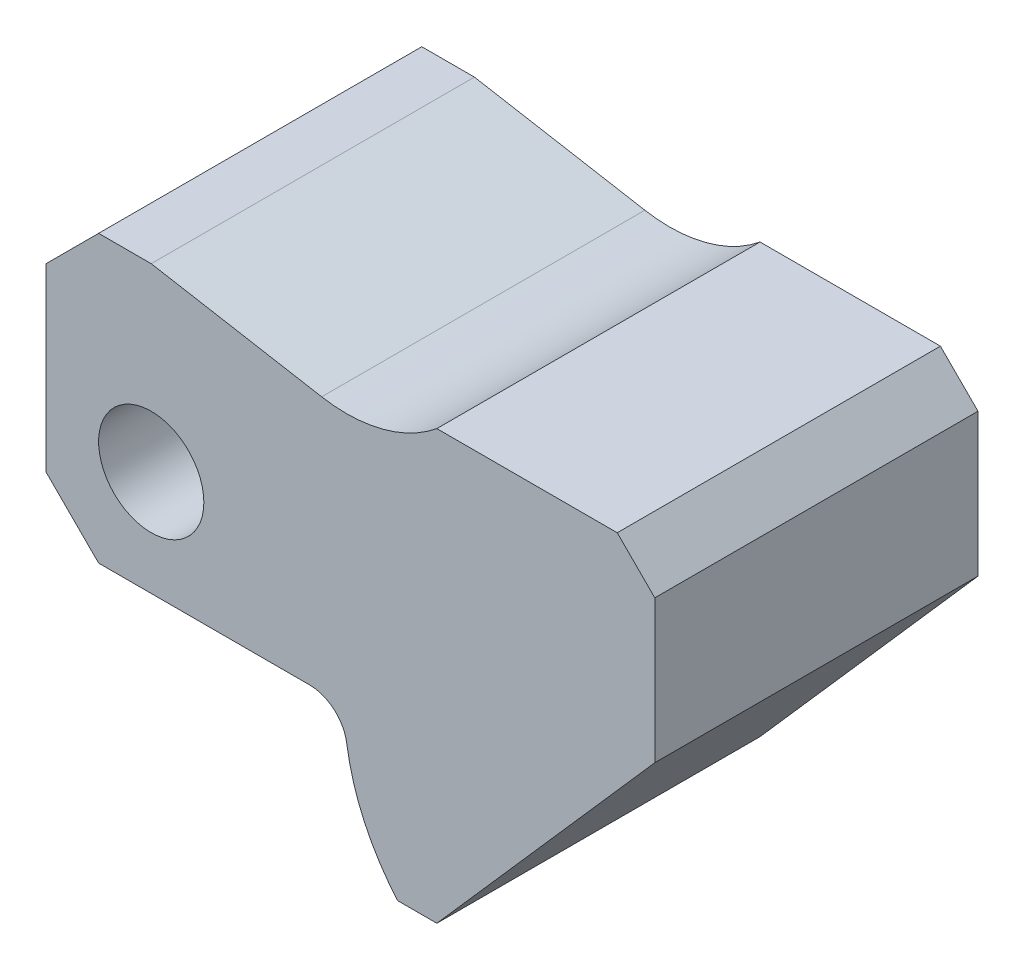
ISO-10303-21;
HEADER;
FILE_DESCRIPTION(('STEP AP214'),'2;1');
FILE_NAME('part.step','',(''),(''),'','','');
FILE_SCHEMA(('AUTOMOTIVE_DESIGN { 1 0 10303 214 1 1 1 1 }'));
ENDSEC;
DATA;
#1=APPLICATION_CONTEXT('core data for automotive mechanical design processes');
#2=APPLICATION_PROTOCOL_DEFINITION('international standard','automotive_design',2000,#1);
#3=PRODUCT_CONTEXT('',#1,'mechanical');
#4=PRODUCT('Part','Part','',(#3));
#5=PRODUCT_RELATED_PRODUCT_CATEGORY('part','',(#4));
#6=PRODUCT_DEFINITION_FORMATION('','',#4);
#7=PRODUCT_DEFINITION_CONTEXT('part definition',#1,'design');
#8=PRODUCT_DEFINITION('design','',#6,#7);
#9=PRODUCT_DEFINITION_SHAPE('','',#8);
#10=(LENGTH_UNIT() NAMED_UNIT(*) SI_UNIT(.MILLI.,.METRE.));
#11=(NAMED_UNIT(*) PLANE_ANGLE_UNIT() SI_UNIT($,.RADIAN.));
#12=(NAMED_UNIT(*) SI_UNIT($,.STERADIAN.) SOLID_ANGLE_UNIT());
#13=UNCERTAINTY_MEASURE_WITH_UNIT(LENGTH_MEASURE(1.E-05),#10,'distance_accuracy_value','');
#14=(GEOMETRIC_REPRESENTATION_CONTEXT(3) GLOBAL_UNCERTAINTY_ASSIGNED_CONTEXT((#13)) GLOBAL_UNIT_ASSIGNED_CONTEXT((#10,
#11,#12)) REPRESENTATION_CONTEXT('',''));
#15=CARTESIAN_POINT('',(0.,0.,0.));
#16=DIRECTION('',(0.,0.,1.));
#17=DIRECTION('',(1.,0.,0.));
#18=AXIS2_PLACEMENT_3D('',#15,#16,#17);
#19=CARTESIAN_POINT('',(0.,0.,43.));
#20=DIRECTION('',(0.,0.,1.));
#21=DIRECTION('',(1.,0.,0.));
#22=AXIS2_PLACEMENT_3D('',#19,#20,#21);
#23=PLANE('',#22);
#24=CARTESIAN_POINT('',(0.,0.,43.));
#25=DIRECTION('',(0.,0.,1.));
#26=DIRECTION('',(1.,0.,0.));
#27=AXIS2_PLACEMENT_3D('',#24,#25,#26);
#28=CIRCLE('',#27,7.);
#29=CARTESIAN_POINT('',(7.,0.,43.));
#30=VERTEX_POINT('',#29);
#31=EDGE_CURVE('E179',#30,#30,#28,.T.);
#32=ORIENTED_EDGE('',*,*,#31,.F.);
#33=EDGE_LOOP('',(#32));
#34=FACE_BOUND('',#33,.T.);
#35=CARTESIAN_POINT('',(25.9775090969731,38.7125698804334,43.));
#36=DIRECTION('',(0.,0.,1.));
#37=DIRECTION('',(1.,0.,0.));
#38=AXIS2_PLACEMENT_3D('',#35,#36,#37);
#39=CIRCLE('',#38,19.0000000000001);
#40=CARTESIAN_POINT('',(22.6781937213015,20.0012225732013,43.));
#41=VERTEX_POINT('',#40);
#42=CARTESIAN_POINT('',(38.0000000000002,24.,43.));
#43=VERTEX_POINT('',#42);
#44=EDGE_CURVE('E163',#41,#43,#39,.T.);
#45=ORIENTED_EDGE('',*,*,#44,.F.);
#46=DIRECTION('',(-0.984807753012209,0.173648177666923,0.));
#47=VECTOR('',#46,1.);
#48=CARTESIAN_POINT('',(4.10424171990786,23.276311449431,43.));
#49=LINE('',#48,#47);
#50=CARTESIAN_POINT('',(-2.02095284951298E-13,24.,43.));
#51=VERTEX_POINT('',#50);
#52=EDGE_CURVE('E58',#41,#51,#49,.T.);
#53=ORIENTED_EDGE('',*,*,#52,.T.);
#54=DIRECTION('',(-1.,0.,0.));
#55=VECTOR('',#54,1.);
#56=CARTESIAN_POINT('',(-14.,24.,43.));
#57=LINE('',#56,#55);
#58=CARTESIAN_POINT('',(-7.00000000000007,24.,43.));
#59=VERTEX_POINT('',#58);
#60=EDGE_CURVE('E158',#51,#59,#57,.T.);
#61=ORIENTED_EDGE('',*,*,#60,.T.);
#62=DIRECTION('',(0.707106781186544,0.707106781186551,0.));
#63=VECTOR('',#62,1.);
#64=CARTESIAN_POINT('',(-14.,17.,43.));
#65=LINE('',#64,#63);
#66=CARTESIAN_POINT('',(-14.,17.,43.));
#67=VERTEX_POINT('',#66);
#68=EDGE_CURVE('E169',#67,#59,#65,.T.);
#69=ORIENTED_EDGE('',*,*,#68,.F.);
#70=DIRECTION('',(0.,-1.,0.));
#71=VECTOR('',#70,1.);
#72=CARTESIAN_POINT('',(-14.,24.,43.));
#73=LINE('',#72,#71);
#74=CARTESIAN_POINT('',(-14.,-7.00000000000002,43.));
#75=VERTEX_POINT('',#74);
#76=EDGE_CURVE('E228',#67,#75,#73,.T.);
#77=ORIENTED_EDGE('',*,*,#76,.T.);
#78=DIRECTION('',(-0.707106781186557,0.707106781186538,0.));
#79=VECTOR('',#78,1.);
#80=CARTESIAN_POINT('',(-14.,-7.00000000000002,43.));
#81=LINE('',#80,#79);
#82=CARTESIAN_POINT('',(-6.99999999999983,-14.,43.));
#83=VERTEX_POINT('',#82);
#84=EDGE_CURVE('E176',#83,#75,#81,.T.);
#85=ORIENTED_EDGE('',*,*,#84,.F.);
#86=DIRECTION('',(-1.,0.,0.));
#87=VECTOR('',#86,1.);
#88=CARTESIAN_POINT('',(-30.3655179173529,-14.,43.));
#89=LINE('',#88,#87);
#90=CARTESIAN_POINT('',(21.0666262553692,-14.,43.));
#91=VERTEX_POINT('',#90);
#92=EDGE_CURVE('E239',#91,#83,#89,.T.);
#93=ORIENTED_EDGE('',*,*,#92,.F.);
#94=CARTESIAN_POINT('',(21.0666262553692,-19.,43.));
#95=DIRECTION('',(0.,0.,1.));
#96=DIRECTION('',(1.,0.,0.));
#97=AXIS2_PLACEMENT_3D('',#94,#95,#96);
#98=CIRCLE('',#97,5.);
#99=CARTESIAN_POINT('',(26.012264996781,-18.264705882353,43.));
#100=VERTEX_POINT('',#99);
#101=EDGE_CURVE('E196',#91,#100,#98,.F.);
#102=ORIENTED_EDGE('',*,*,#101,.T.);
#103=CARTESIAN_POINT('',(54.6969696969697,-14.,43.));
#104=DIRECTION('',(0.,0.,-1.));
#105=DIRECTION('',(1.,0.,0.));
#106=AXIS2_PLACEMENT_3D('',#103,#104,#105);
#107=CIRCLE('',#106,29.);
#108=CARTESIAN_POINT('',(32.788067396763,-33.,43.));
#109=VERTEX_POINT('',#108);
#110=EDGE_CURVE('E175',#109,#100,#107,.T.);
#111=ORIENTED_EDGE('',*,*,#110,.F.);
#112=DIRECTION('',(1.,0.,0.));
#113=VECTOR('',#112,1.);
#114=CARTESIAN_POINT('',(-14.,-33.,43.));
#115=LINE('',#114,#113);
#116=CARTESIAN_POINT('',(38.,-33.,43.));
#117=VERTEX_POINT('',#116);
#118=EDGE_CURVE('E273',#109,#117,#115,.T.);
#119=ORIENTED_EDGE('',*,*,#118,.T.);
#120=DIRECTION('',(-0.660114607728679,-0.751164898449876,0.));
#121=VECTOR('',#120,1.);
#122=CARTESIAN_POINT('',(38.,-33.,43.));
#123=LINE('',#122,#121);
#124=CARTESIAN_POINT('',(67.,0.,43.));
#125=VERTEX_POINT('',#124);
#126=EDGE_CURVE('E265',#125,#117,#123,.T.);
#127=ORIENTED_EDGE('',*,*,#126,.F.);
#128=DIRECTION('',(0.,1.,0.));
#129=VECTOR('',#128,1.);
#130=CARTESIAN_POINT('',(67.,24.,43.));
#131=LINE('',#130,#129);
#132=CARTESIAN_POINT('',(67.,19.,43.));
#133=VERTEX_POINT('',#132);
#134=EDGE_CURVE('E218',#125,#133,#131,.T.);
#135=ORIENTED_EDGE('',*,*,#134,.T.);
#136=DIRECTION('',(0.70710678118655,-0.707106781186545,0.));
#137=VECTOR('',#136,1.);
#138=CARTESIAN_POINT('',(67.,19.,43.));
#139=LINE('',#138,#137);
#140=CARTESIAN_POINT('',(62.,24.,43.));
#141=VERTEX_POINT('',#140);
#142=EDGE_CURVE('E212',#141,#133,#139,.T.);
#143=ORIENTED_EDGE('',*,*,#142,.F.);
#144=EDGE_CURVE('E208',#141,#43,#57,.T.);
#145=ORIENTED_EDGE('',*,*,#144,.T.);
#146=EDGE_LOOP('',(#45,#53,#61,#69,#77,#85,#93,#102,#111,#119,#127,#135,#143,#145));
#147=FACE_BOUND('',#146,.T.);
#148=ADVANCED_FACE('F42',(#34,#147),#23,.T.);
#149=CARTESIAN_POINT('',(0.,0.,0.));
#150=DIRECTION('',(0.,0.,1.));
#151=DIRECTION('',(1.,0.,0.));
#152=AXIS2_PLACEMENT_3D('',#149,#150,#151);
#153=PLANE('',#152);
#154=CARTESIAN_POINT('',(0.,0.,0.));
#155=DIRECTION('',(0.,0.,1.));
#156=DIRECTION('',(1.,0.,0.));
#157=AXIS2_PLACEMENT_3D('',#154,#155,#156);
#158=CIRCLE('',#157,7.);
#159=CARTESIAN_POINT('',(7.,0.,0.));
#160=VERTEX_POINT('',#159);
#161=EDGE_CURVE('E236',#160,#160,#158,.T.);
#162=ORIENTED_EDGE('',*,*,#161,.T.);
#163=EDGE_LOOP('',(#162));
#164=FACE_BOUND('',#163,.T.);
#165=DIRECTION('',(-0.984807753012209,0.173648177666923,0.));
#166=VECTOR('',#165,1.);
#167=CARTESIAN_POINT('',(4.10424171990786,23.276311449431,0.));
#168=LINE('',#167,#166);
#169=CARTESIAN_POINT('',(22.6781937213015,20.0012225732013,0.));
#170=VERTEX_POINT('',#169);
#171=CARTESIAN_POINT('',(0.,24.,0.));
#172=VERTEX_POINT('',#171);
#173=EDGE_CURVE('E146',#170,#172,#168,.T.);
#174=ORIENTED_EDGE('',*,*,#173,.F.);
#175=CARTESIAN_POINT('',(25.9775090969731,38.7125698804334,0.));
#176=DIRECTION('',(0.,0.,1.));
#177=DIRECTION('',(1.,0.,0.));
#178=AXIS2_PLACEMENT_3D('',#175,#176,#177);
#179=CIRCLE('',#178,19.0000000000001);
#180=CARTESIAN_POINT('',(38.0000000000002,24.,0.));
#181=VERTEX_POINT('',#180);
#182=EDGE_CURVE('E167',#170,#181,#179,.T.);
#183=ORIENTED_EDGE('',*,*,#182,.T.);
#184=DIRECTION('',(-1.,0.,0.));
#185=VECTOR('',#184,1.);
#186=CARTESIAN_POINT('',(-14.,24.,0.));
#187=LINE('',#186,#185);
#188=CARTESIAN_POINT('',(62.,24.,0.));
#189=VERTEX_POINT('',#188);
#190=EDGE_CURVE('E152',#189,#181,#187,.T.);
#191=ORIENTED_EDGE('',*,*,#190,.F.);
#192=DIRECTION('',(0.70710678118655,-0.707106781186545,0.));
#193=VECTOR('',#192,1.);
#194=CARTESIAN_POINT('',(42.9999999999998,43.0000000000001,0.));
#195=LINE('',#194,#193);
#196=CARTESIAN_POINT('',(67.,19.,0.));
#197=VERTEX_POINT('',#196);
#198=EDGE_CURVE('E230',#189,#197,#195,.T.);
#199=ORIENTED_EDGE('',*,*,#198,.T.);
#200=DIRECTION('',(0.,1.,0.));
#201=VECTOR('',#200,1.);
#202=CARTESIAN_POINT('',(67.,24.,0.));
#203=LINE('',#202,#201);
#204=CARTESIAN_POINT('',(67.,0.,0.));
#205=VERTEX_POINT('',#204);
#206=EDGE_CURVE('E153',#205,#197,#203,.T.);
#207=ORIENTED_EDGE('',*,*,#206,.F.);
#208=DIRECTION('',(-0.660114607728679,-0.751164898449876,0.));
#209=VECTOR('',#208,1.);
#210=CARTESIAN_POINT('',(37.8046632124353,-33.2222797927461,0.));
#211=LINE('',#210,#209);
#212=CARTESIAN_POINT('',(38.,-33.,0.));
#213=VERTEX_POINT('',#212);
#214=EDGE_CURVE('E213',#205,#213,#211,.T.);
#215=ORIENTED_EDGE('',*,*,#214,.T.);
#216=DIRECTION('',(1.,0.,0.));
#217=VECTOR('',#216,1.);
#218=CARTESIAN_POINT('',(-14.,-33.,0.));
#219=LINE('',#218,#217);
#220=CARTESIAN_POINT('',(32.788067396763,-33.,0.));
#221=VERTEX_POINT('',#220);
#222=EDGE_CURVE('E224',#221,#213,#219,.T.);
#223=ORIENTED_EDGE('',*,*,#222,.F.);
#224=CARTESIAN_POINT('',(54.6969696969697,-14.,0.));
#225=DIRECTION('',(0.,0.,1.));
#226=DIRECTION('',(1.,0.,0.));
#227=AXIS2_PLACEMENT_3D('',#224,#225,#226);
#228=CIRCLE('',#227,29.);
#229=CARTESIAN_POINT('',(26.012264996781,-18.264705882353,0.));
#230=VERTEX_POINT('',#229);
#231=EDGE_CURVE('E184',#230,#221,#228,.T.);
#232=ORIENTED_EDGE('',*,*,#231,.F.);
#233=CARTESIAN_POINT('',(21.0666262553692,-19.,0.));
#234=DIRECTION('',(0.,0.,1.));
#235=DIRECTION('',(1.,0.,0.));
#236=AXIS2_PLACEMENT_3D('',#233,#234,#235);
#237=CIRCLE('',#236,5.);
#238=CARTESIAN_POINT('',(21.0666262553692,-14.,0.));
#239=VERTEX_POINT('',#238);
#240=EDGE_CURVE('E198',#230,#239,#237,.T.);
#241=ORIENTED_EDGE('',*,*,#240,.T.);
#242=DIRECTION('',(-1.,0.,0.));
#243=VECTOR('',#242,1.);
#244=CARTESIAN_POINT('',(0.,-14.,0.));
#245=LINE('',#244,#243);
#246=CARTESIAN_POINT('',(-6.99999999999983,-14.,0.));
#247=VERTEX_POINT('',#246);
#248=EDGE_CURVE('E216',#239,#247,#245,.T.);
#249=ORIENTED_EDGE('',*,*,#248,.T.);
#250=DIRECTION('',(-0.707106781186557,0.707106781186538,0.));
#251=VECTOR('',#250,1.);
#252=CARTESIAN_POINT('',(-10.4999999999998,-10.5000000000001,0.));
#253=LINE('',#252,#251);
#254=CARTESIAN_POINT('',(-14.,-7.00000000000002,0.));
#255=VERTEX_POINT('',#254);
#256=EDGE_CURVE('E245',#247,#255,#253,.T.);
#257=ORIENTED_EDGE('',*,*,#256,.T.);
#258=DIRECTION('',(0.,-1.,0.));
#259=VECTOR('',#258,1.);
#260=CARTESIAN_POINT('',(-14.,24.,0.));
#261=LINE('',#260,#259);
#262=CARTESIAN_POINT('',(-14.,17.,0.));
#263=VERTEX_POINT('',#262);
#264=EDGE_CURVE('E222',#263,#255,#261,.T.);
#265=ORIENTED_EDGE('',*,*,#264,.F.);
#266=DIRECTION('',(0.707106781186544,0.707106781186551,0.));
#267=VECTOR('',#266,1.);
#268=CARTESIAN_POINT('',(-15.5000000000001,15.4999999999999,0.));
#269=LINE('',#268,#267);
#270=CARTESIAN_POINT('',(-7.00000000000008,24.,0.));
#271=VERTEX_POINT('',#270);
#272=EDGE_CURVE('E148',#263,#271,#269,.T.);
#273=ORIENTED_EDGE('',*,*,#272,.T.);
#274=EDGE_CURVE('E142',#172,#271,#187,.T.);
#275=ORIENTED_EDGE('',*,*,#274,.F.);
#276=EDGE_LOOP('',(#174,#183,#191,#199,#207,#215,#223,#232,#241,#249,#257,#265,#273,#275));
#277=FACE_BOUND('',#276,.T.);
#278=ADVANCED_FACE('F144',(#164,#277),#153,.F.);
#279=CARTESIAN_POINT('',(25.9775090969731,38.7125698804334,-1.2E-05));
#280=DIRECTION('',(0.,0.,1.));
#281=DIRECTION('',(1.,0.,0.));
#282=AXIS2_PLACEMENT_3D('',#279,#280,#281);
#283=CYLINDRICAL_SURFACE('',#282,19.0000000000001);
#284=ORIENTED_EDGE('',*,*,#44,.T.);
#285=DIRECTION('',(0.,0.,1.));
#286=VECTOR('',#285,1.);
#287=CARTESIAN_POINT('',(38.0000000000002,24.,-1.2E-05));
#288=LINE('',#287,#286);
#289=EDGE_CURVE('E46',#181,#43,#288,.T.);
#290=ORIENTED_EDGE('',*,*,#289,.F.);
#291=ORIENTED_EDGE('',*,*,#182,.F.);
#292=DIRECTION('',(0.,0.,-1.));
#293=VECTOR('',#292,1.);
#294=CARTESIAN_POINT('',(22.6781937213016,20.0012225732014,134.971061713243));
#295=LINE('',#294,#293);
#296=EDGE_CURVE('E11',#41,#170,#295,.T.);
#297=ORIENTED_EDGE('',*,*,#296,.F.);
#298=EDGE_LOOP('',(#284,#290,#291,#297));
#299=FACE_BOUND('',#298,.T.);
#300=ADVANCED_FACE('F310',(#299),#283,.F.);
#301=CARTESIAN_POINT('',(-14.,24.,43.));
#302=DIRECTION('',(0.,-1.,0.));
#303=DIRECTION('',(0.,0.,-1.));
#304=AXIS2_PLACEMENT_3D('',#301,#302,#303);
#305=PLANE('',#304);
#306=ORIENTED_EDGE('',*,*,#190,.T.);
#307=ORIENTED_EDGE('',*,*,#289,.T.);
#308=ORIENTED_EDGE('',*,*,#144,.F.);
#309=DIRECTION('',(0.,0.,1.));
#310=VECTOR('',#309,1.);
#311=CARTESIAN_POINT('',(62.,24.,-1.2E-05));
#312=LINE('',#311,#310);
#313=EDGE_CURVE('E260',#189,#141,#312,.T.);
#314=ORIENTED_EDGE('',*,*,#313,.F.);
#315=EDGE_LOOP('',(#306,#307,#308,#314));
#316=FACE_BOUND('',#315,.T.);
#317=ADVANCED_FACE('F206',(#316),#305,.F.);
#318=CARTESIAN_POINT('',(-14.,-33.,43.));
#319=DIRECTION('',(0.,1.,0.));
#320=DIRECTION('',(0.,0.,1.));
#321=AXIS2_PLACEMENT_3D('',#318,#319,#320);
#322=PLANE('',#321);
#323=DIRECTION('',(0.,0.,-1.));
#324=VECTOR('',#323,1.);
#325=CARTESIAN_POINT('',(32.788067396763,-33.,43.));
#326=LINE('',#325,#324);
#327=EDGE_CURVE('E187',#221,#109,#326,.F.);
#328=ORIENTED_EDGE('',*,*,#327,.F.);
#329=ORIENTED_EDGE('',*,*,#222,.T.);
#330=DIRECTION('',(0.,0.,1.));
#331=VECTOR('',#330,1.);
#332=CARTESIAN_POINT('',(38.,-33.,-1.2E-05));
#333=LINE('',#332,#331);
#334=EDGE_CURVE('E225',#213,#117,#333,.T.);
#335=ORIENTED_EDGE('',*,*,#334,.T.);
#336=ORIENTED_EDGE('',*,*,#118,.F.);
#337=EDGE_LOOP('',(#328,#329,#335,#336));
#338=FACE_BOUND('',#337,.T.);
#339=ADVANCED_FACE('F322',(#338),#322,.F.);
#340=CARTESIAN_POINT('',(-14.,24.,43.));
#341=DIRECTION('',(1.,0.,0.));
#342=DIRECTION('',(0.,1.,0.));
#343=AXIS2_PLACEMENT_3D('',#340,#341,#342);
#344=PLANE('',#343);
#345=ORIENTED_EDGE('',*,*,#76,.F.);
#346=DIRECTION('',(0.,0.,1.));
#347=VECTOR('',#346,1.);
#348=CARTESIAN_POINT('',(-14.,17.,-1.2E-05));
#349=LINE('',#348,#347);
#350=EDGE_CURVE('E172',#263,#67,#349,.T.);
#351=ORIENTED_EDGE('',*,*,#350,.F.);
#352=ORIENTED_EDGE('',*,*,#264,.T.);
#353=DIRECTION('',(0.,0.,1.));
#354=VECTOR('',#353,1.);
#355=CARTESIAN_POINT('',(-14.,-7.00000000000002,43.));
#356=LINE('',#355,#354);
#357=EDGE_CURVE('E240',#255,#75,#356,.T.);
#358=ORIENTED_EDGE('',*,*,#357,.T.);
#359=EDGE_LOOP('',(#345,#351,#352,#358));
#360=FACE_BOUND('',#359,.T.);
#361=ADVANCED_FACE('F287',(#360),#344,.F.);
#362=CARTESIAN_POINT('',(67.,24.,43.));
#363=DIRECTION('',(-1.,0.,0.));
#364=DIRECTION('',(0.,-1.,0.));
#365=AXIS2_PLACEMENT_3D('',#362,#363,#364);
#366=PLANE('',#365);
#367=ORIENTED_EDGE('',*,*,#206,.T.);
#368=DIRECTION('',(0.,0.,1.));
#369=VECTOR('',#368,1.);
#370=CARTESIAN_POINT('',(67.,19.,-1.2E-05));
#371=LINE('',#370,#369);
#372=EDGE_CURVE('E269',#197,#133,#371,.T.);
#373=ORIENTED_EDGE('',*,*,#372,.T.);
#374=ORIENTED_EDGE('',*,*,#134,.F.);
#375=DIRECTION('',(0.,0.,1.));
#376=VECTOR('',#375,1.);
#377=CARTESIAN_POINT('',(67.,0.,-1.2E-05));
#378=LINE('',#377,#376);
#379=EDGE_CURVE('E268',#205,#125,#378,.T.);
#380=ORIENTED_EDGE('',*,*,#379,.F.);
#381=EDGE_LOOP('',(#367,#373,#374,#380));
#382=FACE_BOUND('',#381,.T.);
#383=ADVANCED_FACE('F281',(#382),#366,.F.);
#384=ORIENTED_EDGE('',*,*,#60,.F.);
#385=DIRECTION('',(0.,0.,-1.));
#386=VECTOR('',#385,1.);
#387=CARTESIAN_POINT('',(0.,24.,134.971061713243));
#388=LINE('',#387,#386);
#389=EDGE_CURVE('E156',#51,#172,#388,.T.);
#390=ORIENTED_EDGE('',*,*,#389,.T.);
#391=ORIENTED_EDGE('',*,*,#274,.T.);
#392=DIRECTION('',(0.,0.,1.));
#393=VECTOR('',#392,1.);
#394=CARTESIAN_POINT('',(-7.00000000000007,24.,43.));
#395=LINE('',#394,#393);
#396=EDGE_CURVE('E199',#271,#59,#395,.T.);
#397=ORIENTED_EDGE('',*,*,#396,.T.);
#398=EDGE_LOOP('',(#384,#390,#391,#397));
#399=FACE_BOUND('',#398,.T.);
#400=ADVANCED_FACE('F157',(#399),#305,.F.);
#401=CARTESIAN_POINT('',(38.,-33.,-1.2E-05));
#402=DIRECTION('',(-0.751164898449876,0.660114607728679,0.));
#403=DIRECTION('',(-0.660114607728679,-0.751164898449876,0.));
#404=AXIS2_PLACEMENT_3D('',#401,#402,#403);
#405=PLANE('',#404);
#406=ORIENTED_EDGE('',*,*,#379,.T.);
#407=ORIENTED_EDGE('',*,*,#126,.T.);
#408=ORIENTED_EDGE('',*,*,#334,.F.);
#409=ORIENTED_EDGE('',*,*,#214,.F.);
#410=EDGE_LOOP('',(#406,#407,#408,#409));
#411=FACE_BOUND('',#410,.T.);
#412=ADVANCED_FACE('F315',(#411),#405,.F.);
#413=CARTESIAN_POINT('',(-30.3655179173529,-14.,-1.2E-05));
#414=DIRECTION('',(0.,1.,0.));
#415=DIRECTION('',(0.,0.,1.));
#416=AXIS2_PLACEMENT_3D('',#413,#414,#415);
#417=PLANE('',#416);
#418=ORIENTED_EDGE('',*,*,#248,.F.);
#419=DIRECTION('',(0.,0.,-1.));
#420=VECTOR('',#419,1.);
#421=CARTESIAN_POINT('',(21.0666262553692,-14.,-1.2E-05));
#422=LINE('',#421,#420);
#423=EDGE_CURVE('E192',#239,#91,#422,.F.);
#424=ORIENTED_EDGE('',*,*,#423,.T.);
#425=ORIENTED_EDGE('',*,*,#92,.T.);
#426=DIRECTION('',(0.,0.,-1.));
#427=VECTOR('',#426,1.);
#428=CARTESIAN_POINT('',(-6.99999999999983,-14.,-1.2E-05));
#429=LINE('',#428,#427);
#430=EDGE_CURVE('E233',#83,#247,#429,.T.);
#431=ORIENTED_EDGE('',*,*,#430,.T.);
#432=EDGE_LOOP('',(#418,#424,#425,#431));
#433=FACE_BOUND('',#432,.T.);
#434=ADVANCED_FACE('F257',(#433),#417,.F.);
#435=CARTESIAN_POINT('',(67.,19.,-1.2E-05));
#436=DIRECTION('',(-0.707106781186545,-0.70710678118655,0.));
#437=DIRECTION('',(0.70710678118655,-0.707106781186545,0.));
#438=AXIS2_PLACEMENT_3D('',#435,#436,#437);
#439=PLANE('',#438);
#440=ORIENTED_EDGE('',*,*,#313,.T.);
#441=ORIENTED_EDGE('',*,*,#142,.T.);
#442=ORIENTED_EDGE('',*,*,#372,.F.);
#443=ORIENTED_EDGE('',*,*,#198,.F.);
#444=EDGE_LOOP('',(#440,#441,#442,#443));
#445=FACE_BOUND('',#444,.T.);
#446=ADVANCED_FACE('F401',(#445),#439,.F.);
#447=CARTESIAN_POINT('',(54.6969696969697,-14.,43.));
#448=DIRECTION('',(0.,0.,-1.));
#449=DIRECTION('',(-1.,0.,0.));
#450=AXIS2_PLACEMENT_3D('',#447,#448,#449);
#451=CYLINDRICAL_SURFACE('',#450,29.);
#452=ORIENTED_EDGE('',*,*,#110,.T.);
#453=DIRECTION('',(0.,0.,-1.));
#454=VECTOR('',#453,1.);
#455=CARTESIAN_POINT('',(26.0122649967811,-18.264705882353,43.));
#456=LINE('',#455,#454);
#457=EDGE_CURVE('E194',#100,#230,#456,.T.);
#458=ORIENTED_EDGE('',*,*,#457,.T.);
#459=ORIENTED_EDGE('',*,*,#231,.T.);
#460=ORIENTED_EDGE('',*,*,#327,.T.);
#461=EDGE_LOOP('',(#452,#458,#459,#460));
#462=FACE_BOUND('',#461,.T.);
#463=ADVANCED_FACE('F395',(#462),#451,.T.);
#464=CARTESIAN_POINT('',(-14.,-7.00000000000002,-1.2E-05));
#465=DIRECTION('',(0.707106781186538,0.707106781186557,0.));
#466=DIRECTION('',(-0.707106781186557,0.707106781186538,0.));
#467=AXIS2_PLACEMENT_3D('',#464,#465,#466);
#468=PLANE('',#467);
#469=ORIENTED_EDGE('',*,*,#256,.F.);
#470=ORIENTED_EDGE('',*,*,#430,.F.);
#471=ORIENTED_EDGE('',*,*,#84,.T.);
#472=ORIENTED_EDGE('',*,*,#357,.F.);
#473=EDGE_LOOP('',(#469,#470,#471,#472));
#474=FACE_BOUND('',#473,.T.);
#475=ADVANCED_FACE('F254',(#474),#468,.F.);
#476=CARTESIAN_POINT('',(0.,0.,-1.2E-05));
#477=DIRECTION('',(0.,0.,1.));
#478=DIRECTION('',(1.,0.,0.));
#479=AXIS2_PLACEMENT_3D('',#476,#477,#478);
#480=CYLINDRICAL_SURFACE('',#479,7.);
#481=CARTESIAN_POINT('',(7.,0.,43.));
#482=CARTESIAN_POINT('',(7.,0.,42.5520833333333));
#483=CARTESIAN_POINT('',(7.,0.,42.1041666666667));
#484=CARTESIAN_POINT('',(7.,0.,41.2083333333333));
#485=CARTESIAN_POINT('',(7.,0.,40.7604166666667));
#486=CARTESIAN_POINT('',(7.,0.,39.8645833333333));
#487=CARTESIAN_POINT('',(7.,0.,39.4166666666667));
#488=CARTESIAN_POINT('',(7.,0.,38.5208333333333));
#489=CARTESIAN_POINT('',(7.,0.,38.0729166666667));
#490=CARTESIAN_POINT('',(7.,0.,37.1770833333333));
#491=CARTESIAN_POINT('',(7.,0.,36.7291666666667));
#492=CARTESIAN_POINT('',(7.,0.,35.8333333333333));
#493=CARTESIAN_POINT('',(7.,0.,35.3854166666667));
#494=CARTESIAN_POINT('',(7.,0.,34.4895833333333));
#495=CARTESIAN_POINT('',(7.,0.,34.0416666666667));
#496=CARTESIAN_POINT('',(7.,0.,33.1458333333333));
#497=CARTESIAN_POINT('',(7.,0.,32.6979166666667));
#498=CARTESIAN_POINT('',(7.,0.,31.8020833333333));
#499=CARTESIAN_POINT('',(7.,0.,31.3541666666667));
#500=CARTESIAN_POINT('',(7.,0.,30.4583333333333));
#501=CARTESIAN_POINT('',(7.,0.,30.0104166666667));
#502=CARTESIAN_POINT('',(7.,0.,29.1145833333333));
#503=CARTESIAN_POINT('',(7.,0.,28.6666666666667));
#504=CARTESIAN_POINT('',(7.,0.,27.7708333333333));
#505=CARTESIAN_POINT('',(7.,0.,27.3229166666667));
#506=CARTESIAN_POINT('',(7.,0.,26.4270833333333));
#507=CARTESIAN_POINT('',(7.,0.,25.9791666666667));
#508=CARTESIAN_POINT('',(7.,0.,25.0833333333333));
#509=CARTESIAN_POINT('',(7.,0.,24.6354166666667));
#510=CARTESIAN_POINT('',(7.,0.,23.7395833333333));
#511=CARTESIAN_POINT('',(7.,0.,23.2916666666667));
#512=CARTESIAN_POINT('',(7.,0.,22.3958333333333));
#513=CARTESIAN_POINT('',(7.,0.,21.9479166666667));
#514=CARTESIAN_POINT('',(7.,0.,21.0520833333333));
#515=CARTESIAN_POINT('',(7.,0.,20.6041666666667));
#516=CARTESIAN_POINT('',(7.,0.,19.7083333333333));
#517=CARTESIAN_POINT('',(7.,0.,19.2604166666667));
#518=CARTESIAN_POINT('',(7.,0.,18.3645833333333));
#519=CARTESIAN_POINT('',(7.,0.,17.9166666666667));
#520=CARTESIAN_POINT('',(7.,0.,17.0208333333333));
#521=CARTESIAN_POINT('',(7.,0.,16.5729166666667));
#522=CARTESIAN_POINT('',(7.,0.,15.6770833333333));
#523=CARTESIAN_POINT('',(7.,0.,15.2291666666667));
#524=CARTESIAN_POINT('',(7.,0.,14.3333333333333));
#525=CARTESIAN_POINT('',(7.,0.,13.8854166666667));
#526=CARTESIAN_POINT('',(7.,0.,12.9895833333333));
#527=CARTESIAN_POINT('',(7.,0.,12.5416666666667));
#528=CARTESIAN_POINT('',(7.,0.,11.6458333333333));
#529=CARTESIAN_POINT('',(7.,0.,11.1979166666667));
#530=CARTESIAN_POINT('',(7.,0.,10.3020833333333));
#531=CARTESIAN_POINT('',(7.,0.,9.85416666666666));
#532=CARTESIAN_POINT('',(7.,0.,8.95833333333333));
#533=CARTESIAN_POINT('',(7.,0.,8.51041666666666));
#534=CARTESIAN_POINT('',(7.,0.,7.61458333333333));
#535=CARTESIAN_POINT('',(7.,0.,7.16666666666667));
#536=CARTESIAN_POINT('',(7.,0.,6.27083333333333));
#537=CARTESIAN_POINT('',(7.,0.,5.82291666666667));
#538=CARTESIAN_POINT('',(7.,0.,4.92708333333333));
#539=CARTESIAN_POINT('',(7.,0.,4.47916666666667));
#540=CARTESIAN_POINT('',(7.,0.,3.58333333333333));
#541=CARTESIAN_POINT('',(7.,0.,3.13541666666667));
#542=CARTESIAN_POINT('',(7.,0.,2.23958333333333));
#543=CARTESIAN_POINT('',(7.,0.,1.79166666666667));
#544=CARTESIAN_POINT('',(7.,0.,0.895833333333333));
#545=CARTESIAN_POINT('',(7.,0.,0.447916666666668));
#546=CARTESIAN_POINT('',(7.,0.,0.));
#547=B_SPLINE_CURVE_WITH_KNOTS('',3,(#481,#482,#483,#484,#485,#486,#487,#488,#489,#490,#491,
#492,#493,#494,#495,#496,#497,#498,#499,#500,#501,#502,#503,#504,#505,#506,#507,#508,#509,#510,
#511,#512,#513,#514,#515,#516,#517,#518,#519,#520,#521,#522,#523,#524,#525,#526,#527,#528,#529,
#530,#531,#532,#533,#534,#535,#536,#537,#538,#539,#540,#541,#542,#543,#544,#545,#546),
.UNSPECIFIED.,.F.,.F.,(4,2,2,2,2,2,2,2,2,2,2,2,2,2,2,2,2,2,2,2,2,2,2,2,2,2,2,2,2,2,2,2,4),(0.,
1.34375,2.6875,4.03125,5.375,6.71875,8.0625,9.40625000000001,10.75,12.09375,13.4375,14.78125,
16.125,17.46875,18.8125,20.15625,21.5,22.84375,24.1875,25.53125,26.875,28.21875,29.5625,
30.90625,32.25,33.59375,34.9375,36.28125,37.625,38.96875,40.3125,41.65625,43.),.UNSPECIFIED.);
#548=EDGE_CURVE('BSEAM301',#30,#160,#547,.T.);
#549=ORIENTED_EDGE('',*,*,#31,.T.);
#550=ORIENTED_EDGE('',*,*,#161,.F.);
#551=ORIENTED_EDGE('',*,*,#548,.T.);
#552=ORIENTED_EDGE('',*,*,#548,.F.);
#553=EDGE_LOOP('',(#549,#551,#550,#552));
#554=FACE_BOUND('',#553,.T.);
#555=ADVANCED_FACE('F301',(#554),#480,.F.);
#556=CARTESIAN_POINT('',(21.0666262553692,-19.,43.));
#557=DIRECTION('',(0.,0.,-1.));
#558=DIRECTION('',(-1.,0.,0.));
#559=AXIS2_PLACEMENT_3D('',#556,#557,#558);
#560=CYLINDRICAL_SURFACE('',#559,5.);
#561=ORIENTED_EDGE('',*,*,#240,.F.);
#562=ORIENTED_EDGE('',*,*,#457,.F.);
#563=ORIENTED_EDGE('',*,*,#101,.F.);
#564=ORIENTED_EDGE('',*,*,#423,.F.);
#565=EDGE_LOOP('',(#561,#562,#563,#564));
#566=FACE_BOUND('',#565,.T.);
#567=ADVANCED_FACE('F44',(#566),#560,.F.);
#568=CARTESIAN_POINT('',(-14.,17.,-1.2E-05));
#569=DIRECTION('',(0.707106781186551,-0.707106781186544,0.));
#570=DIRECTION('',(0.707106781186544,0.707106781186551,0.));
#571=AXIS2_PLACEMENT_3D('',#568,#569,#570);
#572=PLANE('',#571);
#573=ORIENTED_EDGE('',*,*,#350,.T.);
#574=ORIENTED_EDGE('',*,*,#68,.T.);
#575=ORIENTED_EDGE('',*,*,#396,.F.);
#576=ORIENTED_EDGE('',*,*,#272,.F.);
#577=EDGE_LOOP('',(#573,#574,#575,#576));
#578=FACE_BOUND('',#577,.T.);
#579=ADVANCED_FACE('F291',(#578),#572,.F.);
#580=CARTESIAN_POINT('',(0.,24.,134.971061713243));
#581=DIRECTION('',(0.173648177666923,0.984807753012209,0.));
#582=DIRECTION('',(-0.984807753012209,0.173648177666923,0.));
#583=AXIS2_PLACEMENT_3D('',#580,#581,#582);
#584=PLANE('',#583);
#585=ORIENTED_EDGE('',*,*,#52,.F.);
#586=ORIENTED_EDGE('',*,*,#296,.T.);
#587=ORIENTED_EDGE('',*,*,#173,.T.);
#588=ORIENTED_EDGE('',*,*,#389,.F.);
#589=EDGE_LOOP('',(#585,#586,#587,#588));
#590=FACE_BOUND('',#589,.T.);
#591=ADVANCED_FACE('F161',(#590),#584,.T.);
#592=CLOSED_SHELL('',(#148,#278,#300,#317,#339,#361,#383,#400,#412,#434,#446,#463,#475,#555,
#567,#579,#591));
#593=MANIFOLD_SOLID_BREP('B2',#592);
#594=ADVANCED_BREP_SHAPE_REPRESENTATION('',(#18,#593),#14);
#595=SHAPE_DEFINITION_REPRESENTATION(#9,#594);
ENDSEC;
END-ISO-10303-21;
